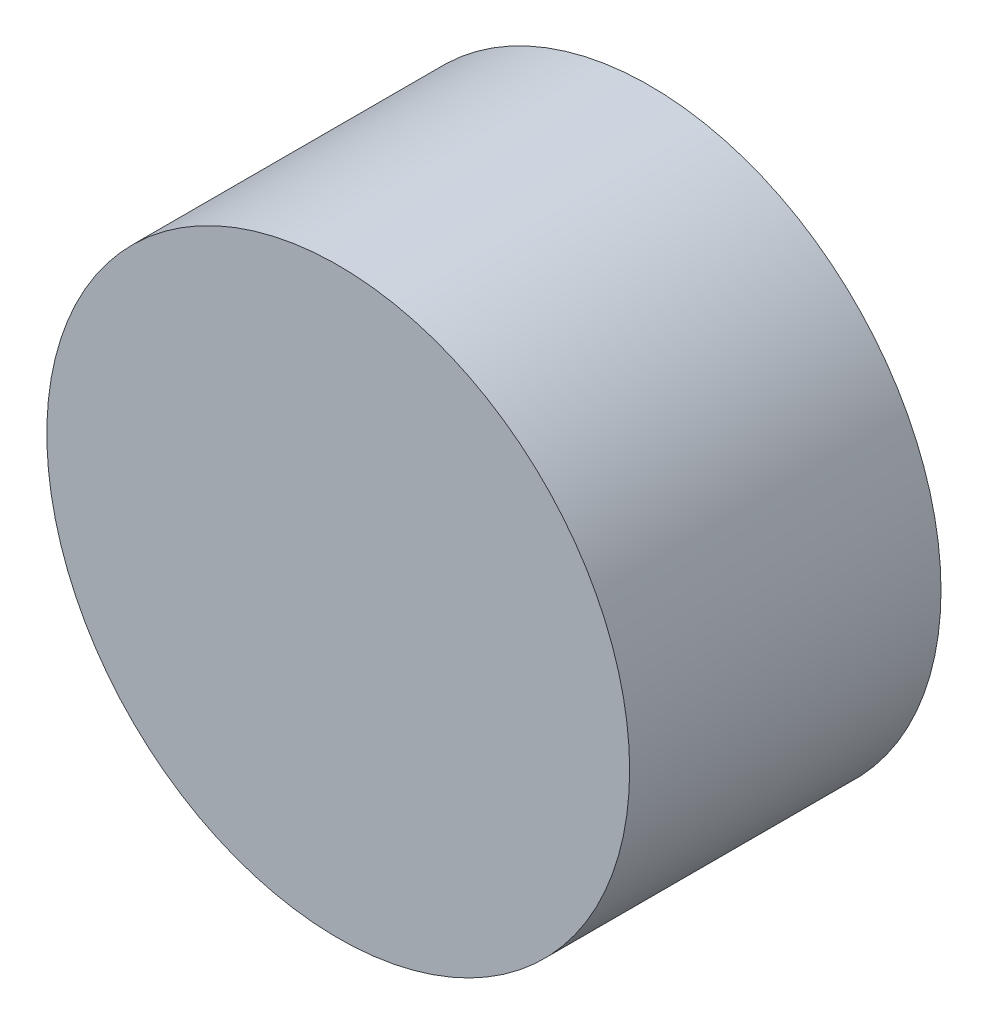
ISO-10303-21;
HEADER;
FILE_DESCRIPTION(('STEP AP214'),'2;1');
FILE_NAME('part.step','',(''),(''),'','','');
FILE_SCHEMA(('AUTOMOTIVE_DESIGN { 1 0 10303 214 1 1 1 1 }'));
ENDSEC;
DATA;
#1=APPLICATION_CONTEXT('core data for automotive mechanical design processes');
#2=APPLICATION_PROTOCOL_DEFINITION('international standard','automotive_design',2000,#1);
#3=PRODUCT_CONTEXT('',#1,'mechanical');
#4=PRODUCT('Part','Part','',(#3));
#5=PRODUCT_RELATED_PRODUCT_CATEGORY('part','',(#4));
#6=PRODUCT_DEFINITION_FORMATION('','',#4);
#7=PRODUCT_DEFINITION_CONTEXT('part definition',#1,'design');
#8=PRODUCT_DEFINITION('design','',#6,#7);
#9=PRODUCT_DEFINITION_SHAPE('','',#8);
#10=(LENGTH_UNIT() NAMED_UNIT(*) SI_UNIT(.MILLI.,.METRE.));
#11=(NAMED_UNIT(*) PLANE_ANGLE_UNIT() SI_UNIT($,.RADIAN.));
#12=(NAMED_UNIT(*) SI_UNIT($,.STERADIAN.) SOLID_ANGLE_UNIT());
#13=UNCERTAINTY_MEASURE_WITH_UNIT(LENGTH_MEASURE(1.E-05),#10,'distance_accuracy_value','');
#14=(GEOMETRIC_REPRESENTATION_CONTEXT(3) GLOBAL_UNCERTAINTY_ASSIGNED_CONTEXT((#13)) GLOBAL_UNIT_ASSIGNED_CONTEXT((#10,
#11,#12)) REPRESENTATION_CONTEXT('',''));
#15=CARTESIAN_POINT('',(0.,0.,0.));
#16=DIRECTION('',(0.,0.,1.));
#17=DIRECTION('',(1.,0.,0.));
#18=AXIS2_PLACEMENT_3D('',#15,#16,#17);
#19=CARTESIAN_POINT('',(0.,0.,16.10868));
#20=DIRECTION('',(0.,0.,-1.));
#21=DIRECTION('',(-1.,0.,0.));
#22=AXIS2_PLACEMENT_3D('',#19,#20,#21);
#23=CYLINDRICAL_SURFACE('',#22,15.07617);
#24=CARTESIAN_POINT('',(0.,0.,16.10868));
#25=DIRECTION('',(0.,0.,1.));
#26=DIRECTION('',(1.,0.,0.));
#27=AXIS2_PLACEMENT_3D('',#24,#25,#26);
#28=CIRCLE('',#27,15.07617);
#29=CARTESIAN_POINT('',(15.07617,0.,16.10868));
#30=VERTEX_POINT('',#29);
#31=EDGE_CURVE('E10',#30,#30,#28,.T.);
#32=ORIENTED_EDGE('',*,*,#31,.F.);
#33=EDGE_LOOP('',(#32));
#34=FACE_BOUND('',#33,.T.);
#35=CARTESIAN_POINT('',(0.,0.,0.));
#36=DIRECTION('',(0.,0.,1.));
#37=DIRECTION('',(1.,0.,0.));
#38=AXIS2_PLACEMENT_3D('',#35,#36,#37);
#39=CIRCLE('',#38,15.07617);
#40=CARTESIAN_POINT('',(15.07617,0.,0.));
#41=VERTEX_POINT('',#40);
#42=EDGE_CURVE('E33',#41,#41,#39,.T.);
#43=ORIENTED_EDGE('',*,*,#42,.T.);
#44=EDGE_LOOP('',(#43));
#45=FACE_BOUND('',#44,.T.);
#46=ADVANCED_FACE('F30',(#34,#45),#23,.T.);
#47=CARTESIAN_POINT('',(0.,0.,16.10868));
#48=DIRECTION('',(0.,0.,1.));
#49=DIRECTION('',(1.,0.,0.));
#50=AXIS2_PLACEMENT_3D('',#47,#48,#49);
#51=PLANE('',#50);
#52=ORIENTED_EDGE('',*,*,#31,.T.);
#53=EDGE_LOOP('',(#52));
#54=FACE_BOUND('',#53,.T.);
#55=ADVANCED_FACE('F72',(#54),#51,.T.);
#56=CARTESIAN_POINT('',(0.,0.,0.));
#57=DIRECTION('',(0.,0.,1.));
#58=DIRECTION('',(1.,0.,0.));
#59=AXIS2_PLACEMENT_3D('',#56,#57,#58);
#60=PLANE('',#59);
#61=CARTESIAN_POINT('',(0.,0.,0.));
#62=DIRECTION('',(0.,0.,-1.));
#63=DIRECTION('',(-1.,0.,0.));
#64=AXIS2_PLACEMENT_3D('',#61,#62,#63);
#65=CIRCLE('',#64,9.3853);
#66=CARTESIAN_POINT('',(-9.3853,0.,0.));
#67=VERTEX_POINT('',#66);
#68=EDGE_CURVE('E42',#67,#67,#65,.T.);
#69=ORIENTED_EDGE('',*,*,#68,.F.);
#70=EDGE_LOOP('',(#69));
#71=FACE_BOUND('',#70,.T.);
#72=ORIENTED_EDGE('',*,*,#42,.F.);
#73=EDGE_LOOP('',(#72));
#74=FACE_BOUND('',#73,.T.);
#75=ADVANCED_FACE('F66',(#71,#74),#60,.F.);
#76=CARTESIAN_POINT('',(0.,0.,4.7498));
#77=DIRECTION('',(0.,0.,-1.));
#78=DIRECTION('',(-1.,0.,0.));
#79=AXIS2_PLACEMENT_3D('',#76,#77,#78);
#80=CYLINDRICAL_SURFACE('',#79,9.3853);
#81=CARTESIAN_POINT('',(0.,0.,4.7498));
#82=DIRECTION('',(0.,0.,-1.));
#83=DIRECTION('',(-1.,0.,0.));
#84=AXIS2_PLACEMENT_3D('',#81,#82,#83);
#85=CIRCLE('',#84,9.3853);
#86=CARTESIAN_POINT('',(-9.3853,0.,4.7498));
#87=VERTEX_POINT('',#86);
#88=EDGE_CURVE('E40',#87,#87,#85,.T.);
#89=ORIENTED_EDGE('',*,*,#88,.F.);
#90=EDGE_LOOP('',(#89));
#91=FACE_BOUND('',#90,.T.);
#92=ORIENTED_EDGE('',*,*,#68,.T.);
#93=EDGE_LOOP('',(#92));
#94=FACE_BOUND('',#93,.T.);
#95=ADVANCED_FACE('F60',(#91,#94),#80,.F.);
#96=CARTESIAN_POINT('',(0.,0.,4.7498));
#97=DIRECTION('',(0.,0.,-1.));
#98=DIRECTION('',(-1.,0.,0.));
#99=AXIS2_PLACEMENT_3D('',#96,#97,#98);
#100=PLANE('',#99);
#101=CARTESIAN_POINT('',(0.,0.,4.7498));
#102=DIRECTION('',(0.,0.,-1.));
#103=DIRECTION('',(-1.,0.,0.));
#104=AXIS2_PLACEMENT_3D('',#101,#102,#103);
#105=CIRCLE('',#104,4.5847);
#106=CARTESIAN_POINT('',(-4.5847,0.,4.7498));
#107=VERTEX_POINT('',#106);
#108=EDGE_CURVE('E45',#107,#107,#105,.T.);
#109=ORIENTED_EDGE('',*,*,#108,.F.);
#110=EDGE_LOOP('',(#109));
#111=FACE_BOUND('',#110,.T.);
#112=ORIENTED_EDGE('',*,*,#88,.T.);
#113=EDGE_LOOP('',(#112));
#114=FACE_BOUND('',#113,.T.);
#115=ADVANCED_FACE('F57',(#111,#114),#100,.T.);
#116=CARTESIAN_POINT('',(0.,0.,4.7498));
#117=DIRECTION('',(0.,0.,-1.));
#118=DIRECTION('',(-1.,0.,0.));
#119=AXIS2_PLACEMENT_3D('',#116,#117,#118);
#120=CYLINDRICAL_SURFACE('',#119,4.5847);
#121=ORIENTED_EDGE('',*,*,#108,.T.);
#122=EDGE_LOOP('',(#121));
#123=FACE_BOUND('',#122,.T.);
#124=CARTESIAN_POINT('',(0.,0.,0.));
#125=DIRECTION('',(0.,0.,-1.));
#126=DIRECTION('',(-1.,0.,0.));
#127=AXIS2_PLACEMENT_3D('',#124,#125,#126);
#128=CIRCLE('',#127,4.5847);
#129=CARTESIAN_POINT('',(-4.5847,0.,0.));
#130=VERTEX_POINT('',#129);
#131=EDGE_CURVE('E48',#130,#130,#128,.T.);
#132=ORIENTED_EDGE('',*,*,#131,.F.);
#133=EDGE_LOOP('',(#132));
#134=FACE_BOUND('',#133,.T.);
#135=ADVANCED_FACE('F54',(#123,#134),#120,.T.);
#136=ORIENTED_EDGE('',*,*,#131,.T.);
#137=EDGE_LOOP('',(#136));
#138=FACE_BOUND('',#137,.T.);
#139=ADVANCED_FACE('F73',(#138),#60,.F.);
#140=CLOSED_SHELL('',(#46,#55,#75,#95,#115,#135,#139));
#141=MANIFOLD_SOLID_BREP('B2',#140);
#142=ADVANCED_BREP_SHAPE_REPRESENTATION('',(#18,#141),#14);
#143=SHAPE_DEFINITION_REPRESENTATION(#9,#142);
ENDSEC;
END-ISO-10303-21;
